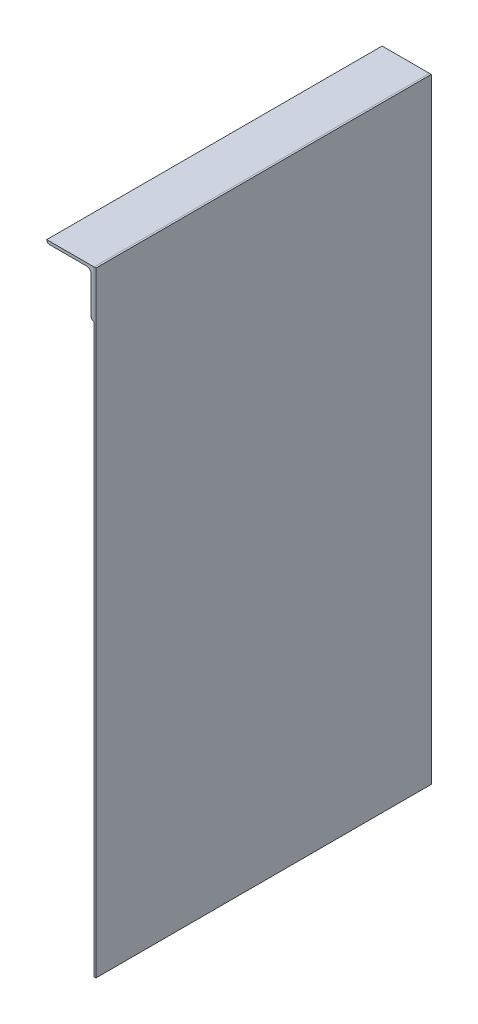
ISO-10303-21;
HEADER;
FILE_DESCRIPTION(('STEP AP214'),'2;1');
FILE_NAME('part.step','',(''),(''),'','','');
FILE_SCHEMA(('AUTOMOTIVE_DESIGN { 1 0 10303 214 1 1 1 1 }'));
ENDSEC;
DATA;
#1=APPLICATION_CONTEXT('core data for automotive mechanical design processes');
#2=APPLICATION_PROTOCOL_DEFINITION('international standard','automotive_design',2000,#1);
#3=PRODUCT_CONTEXT('',#1,'mechanical');
#4=PRODUCT('Part','Part','',(#3));
#5=PRODUCT_RELATED_PRODUCT_CATEGORY('part','',(#4));
#6=PRODUCT_DEFINITION_FORMATION('','',#4);
#7=PRODUCT_DEFINITION_CONTEXT('part definition',#1,'design');
#8=PRODUCT_DEFINITION('design','',#6,#7);
#9=PRODUCT_DEFINITION_SHAPE('','',#8);
#10=(LENGTH_UNIT() NAMED_UNIT(*) SI_UNIT(.MILLI.,.METRE.));
#11=(NAMED_UNIT(*) PLANE_ANGLE_UNIT() SI_UNIT($,.RADIAN.));
#12=(NAMED_UNIT(*) SI_UNIT($,.STERADIAN.) SOLID_ANGLE_UNIT());
#13=UNCERTAINTY_MEASURE_WITH_UNIT(LENGTH_MEASURE(1.E-05),#10,'distance_accuracy_value','');
#14=(GEOMETRIC_REPRESENTATION_CONTEXT(3) GLOBAL_UNCERTAINTY_ASSIGNED_CONTEXT((#13)) GLOBAL_UNIT_ASSIGNED_CONTEXT((#10,
#11,#12)) REPRESENTATION_CONTEXT('',''));
#15=CARTESIAN_POINT('',(0.,0.,0.));
#16=DIRECTION('',(0.,0.,1.));
#17=DIRECTION('',(1.,0.,0.));
#18=AXIS2_PLACEMENT_3D('',#15,#16,#17);
#19=CARTESIAN_POINT('',(2.,0.,0.));
#20=DIRECTION('',(0.,0.,1.));
#21=DIRECTION('',(1.,0.,0.));
#22=AXIS2_PLACEMENT_3D('',#19,#20,#21);
#23=PLANE('',#22);
#24=DIRECTION('',(0.,1.,0.));
#25=VECTOR('',#24,1.);
#26=CARTESIAN_POINT('',(0.,0.,0.));
#27=LINE('',#26,#25);
#28=CARTESIAN_POINT('',(6.91313305090941E-12,-660.,0.));
#29=VERTEX_POINT('',#28);
#30=CARTESIAN_POINT('',(0.,0.,0.));
#31=VERTEX_POINT('',#30);
#32=EDGE_CURVE('E143',#29,#31,#27,.T.);
#33=ORIENTED_EDGE('',*,*,#32,.T.);
#34=DIRECTION('',(-1.,0.,0.));
#35=VECTOR('',#34,1.);
#36=CARTESIAN_POINT('',(2.,0.,0.));
#37=LINE('',#36,#35);
#38=CARTESIAN_POINT('',(2.,0.,0.));
#39=VERTEX_POINT('',#38);
#40=EDGE_CURVE('E14',#39,#31,#37,.T.);
#41=ORIENTED_EDGE('',*,*,#40,.F.);
#42=DIRECTION('',(0.,1.,0.));
#43=VECTOR('',#42,1.);
#44=CARTESIAN_POINT('',(2.,0.,0.));
#45=LINE('',#44,#43);
#46=CARTESIAN_POINT('',(2.00000000000691,-660.,0.));
#47=VERTEX_POINT('',#46);
#48=EDGE_CURVE('E131',#47,#39,#45,.T.);
#49=ORIENTED_EDGE('',*,*,#48,.F.);
#50=DIRECTION('',(-1.,0.,0.));
#51=VECTOR('',#50,1.);
#52=CARTESIAN_POINT('',(2.00000000000691,-660.,0.));
#53=LINE('',#52,#51);
#54=EDGE_CURVE('E139',#47,#29,#53,.T.);
#55=ORIENTED_EDGE('',*,*,#54,.T.);
#56=EDGE_LOOP('',(#33,#41,#49,#55));
#57=FACE_BOUND('',#56,.T.);
#58=ADVANCED_FACE('F80',(#57),#23,.F.);
#59=CARTESIAN_POINT('',(2.,0.,0.));
#60=DIRECTION('',(0.,-1.,0.));
#61=DIRECTION('',(1.,0.,0.));
#62=AXIS2_PLACEMENT_3D('',#59,#60,#61);
#63=PLANE('',#62);
#64=DIRECTION('',(0.,0.,1.));
#65=VECTOR('',#64,1.);
#66=CARTESIAN_POINT('',(0.,0.,0.));
#67=LINE('',#66,#65);
#68=CARTESIAN_POINT('',(0.,0.,360.));
#69=VERTEX_POINT('',#68);
#70=EDGE_CURVE('E135',#31,#69,#67,.T.);
#71=ORIENTED_EDGE('',*,*,#70,.T.);
#72=DIRECTION('',(-1.,0.,0.));
#73=VECTOR('',#72,1.);
#74=CARTESIAN_POINT('',(2.,0.,360.));
#75=LINE('',#74,#73);
#76=CARTESIAN_POINT('',(2.,0.,360.));
#77=VERTEX_POINT('',#76);
#78=EDGE_CURVE('E88',#77,#69,#75,.T.);
#79=ORIENTED_EDGE('',*,*,#78,.F.);
#80=DIRECTION('',(0.,0.,1.));
#81=VECTOR('',#80,1.);
#82=CARTESIAN_POINT('',(2.,0.,0.));
#83=LINE('',#82,#81);
#84=EDGE_CURVE('E126',#39,#77,#83,.T.);
#85=ORIENTED_EDGE('',*,*,#84,.F.);
#86=ORIENTED_EDGE('',*,*,#40,.T.);
#87=EDGE_LOOP('',(#71,#79,#85,#86));
#88=FACE_BOUND('',#87,.T.);
#89=ADVANCED_FACE('F134',(#88),#63,.F.);
#90=CARTESIAN_POINT('',(2.,0.,360.));
#91=DIRECTION('',(0.,0.,-1.));
#92=DIRECTION('',(-1.,0.,0.));
#93=AXIS2_PLACEMENT_3D('',#90,#91,#92);
#94=PLANE('',#93);
#95=DIRECTION('',(0.,-1.,0.));
#96=VECTOR('',#95,1.);
#97=CARTESIAN_POINT('',(0.,0.,360.));
#98=LINE('',#97,#96);
#99=CARTESIAN_POINT('',(6.91313305090941E-12,-660.,360.));
#100=VERTEX_POINT('',#99);
#101=EDGE_CURVE('E113',#69,#100,#98,.T.);
#102=ORIENTED_EDGE('',*,*,#101,.T.);
#103=DIRECTION('',(-1.,0.,0.));
#104=VECTOR('',#103,1.);
#105=CARTESIAN_POINT('',(2.00000000000691,-660.,360.));
#106=LINE('',#105,#104);
#107=CARTESIAN_POINT('',(2.00000000000691,-660.,360.));
#108=VERTEX_POINT('',#107);
#109=EDGE_CURVE('E136',#108,#100,#106,.T.);
#110=ORIENTED_EDGE('',*,*,#109,.F.);
#111=DIRECTION('',(0.,-1.,0.));
#112=VECTOR('',#111,1.);
#113=CARTESIAN_POINT('',(2.,0.,360.));
#114=LINE('',#113,#112);
#115=EDGE_CURVE('E129',#77,#108,#114,.T.);
#116=ORIENTED_EDGE('',*,*,#115,.F.);
#117=ORIENTED_EDGE('',*,*,#78,.T.);
#118=EDGE_LOOP('',(#102,#110,#116,#117));
#119=FACE_BOUND('',#118,.T.);
#120=ADVANCED_FACE('F137',(#119),#94,.F.);
#121=CARTESIAN_POINT('',(2.00000000000691,-660.,0.));
#122=DIRECTION('',(0.,1.,0.));
#123=DIRECTION('',(-1.,0.,0.));
#124=AXIS2_PLACEMENT_3D('',#121,#122,#123);
#125=PLANE('',#124);
#126=DIRECTION('',(0.,0.,-1.));
#127=VECTOR('',#126,1.);
#128=CARTESIAN_POINT('',(6.91313305090941E-12,-660.,0.));
#129=LINE('',#128,#127);
#130=EDGE_CURVE('E119',#100,#29,#129,.T.);
#131=ORIENTED_EDGE('',*,*,#130,.T.);
#132=ORIENTED_EDGE('',*,*,#54,.F.);
#133=DIRECTION('',(0.,0.,-1.));
#134=VECTOR('',#133,1.);
#135=CARTESIAN_POINT('',(2.00000000000691,-660.,0.));
#136=LINE('',#135,#134);
#137=EDGE_CURVE('E96',#108,#47,#136,.T.);
#138=ORIENTED_EDGE('',*,*,#137,.F.);
#139=ORIENTED_EDGE('',*,*,#109,.T.);
#140=EDGE_LOOP('',(#131,#132,#138,#139));
#141=FACE_BOUND('',#140,.T.);
#142=ADVANCED_FACE('F150',(#141),#125,.F.);
#143=CARTESIAN_POINT('',(2.,0.,0.));
#144=DIRECTION('',(-1.,0.,0.));
#145=DIRECTION('',(0.,-1.,0.));
#146=AXIS2_PLACEMENT_3D('',#143,#144,#145);
#147=PLANE('',#146);
#148=ORIENTED_EDGE('',*,*,#48,.T.);
#149=ORIENTED_EDGE('',*,*,#84,.T.);
#150=ORIENTED_EDGE('',*,*,#115,.T.);
#151=ORIENTED_EDGE('',*,*,#137,.T.);
#152=EDGE_LOOP('',(#148,#149,#150,#151));
#153=FACE_BOUND('',#152,.T.);
#154=ADVANCED_FACE('F127',(#153),#147,.F.);
#155=CARTESIAN_POINT('',(0.,0.,0.));
#156=DIRECTION('',(-1.,0.,0.));
#157=DIRECTION('',(0.,-1.,0.));
#158=AXIS2_PLACEMENT_3D('',#155,#156,#157);
#159=PLANE('',#158);
#160=ORIENTED_EDGE('',*,*,#32,.F.);
#161=ORIENTED_EDGE('',*,*,#130,.F.);
#162=ORIENTED_EDGE('',*,*,#101,.F.);
#163=ORIENTED_EDGE('',*,*,#70,.F.);
#164=EDGE_LOOP('',(#160,#161,#162,#163));
#165=FACE_BOUND('',#164,.T.);
#166=ADVANCED_FACE('F153',(#165),#159,.T.);
#167=CLOSED_SHELL('',(#58,#89,#120,#142,#154,#166));
#168=MANIFOLD_SOLID_BREP('B2',#167);
#169=CARTESIAN_POINT('',(-50.8,0.,5.32101756039693E-13));
#170=DIRECTION('',(0.,0.,1.));
#171=DIRECTION('',(1.,0.,0.));
#172=AXIS2_PLACEMENT_3D('',#169,#170,#171);
#173=PLANE('',#172);
#174=DIRECTION('',(-1.,0.,0.));
#175=VECTOR('',#174,1.);
#176=CARTESIAN_POINT('',(-50.8,-5.32101756039694E-13,5.32101756039693E-13));
#177=LINE('',#176,#175);
#178=CARTESIAN_POINT('',(0.,0.,0.));
#179=VERTEX_POINT('',#178);
#180=CARTESIAN_POINT('',(-50.8,-5.32101862300415E-13,5.32101809170054E-13));
#181=VERTEX_POINT('',#180);
#182=EDGE_CURVE('E322',#179,#181,#177,.T.);
#183=ORIENTED_EDGE('',*,*,#182,.F.);
#184=DIRECTION('',(0.,-1.,0.));
#185=VECTOR('',#184,1.);
#186=CARTESIAN_POINT('',(0.,0.,0.));
#187=LINE('',#186,#185);
#188=CARTESIAN_POINT('',(0.,-660.,0.));
#189=VERTEX_POINT('',#188);
#190=EDGE_CURVE('E218',#179,#189,#187,.T.);
#191=ORIENTED_EDGE('',*,*,#190,.T.);
#192=DIRECTION('',(-1.,0.,0.));
#193=VECTOR('',#192,1.);
#194=CARTESIAN_POINT('',(-50.8,-660.,5.32101756039693E-13));
#195=LINE('',#194,#193);
#196=CARTESIAN_POINT('',(-50.8,-660.,5.32101756039693E-13));
#197=VERTEX_POINT('',#196);
#198=EDGE_CURVE('E330',#189,#197,#195,.T.);
#199=ORIENTED_EDGE('',*,*,#198,.T.);
#200=DIRECTION('',(0.,-1.,0.));
#201=VECTOR('',#200,1.);
#202=CARTESIAN_POINT('',(-50.8,0.,5.32101756039693E-13));
#203=LINE('',#202,#201);
#204=EDGE_CURVE('E273',#181,#197,#203,.T.);
#205=ORIENTED_EDGE('',*,*,#204,.F.);
#206=EDGE_LOOP('',(#183,#191,#199,#205));
#207=FACE_BOUND('',#206,.T.);
#208=ADVANCED_FACE('F214',(#207),#173,.F.);
#209=CARTESIAN_POINT('',(-50.8,0.,0.0050800000005321));
#210=DIRECTION('',(1.,0.,0.));
#211=DIRECTION('',(0.,0.,-1.));
#212=AXIS2_PLACEMENT_3D('',#209,#210,#211);
#213=PLANE('',#212);
#214=DIRECTION('',(0.,-0.707106781186548,0.707106781186547));
#215=VECTOR('',#214,1.);
#216=CARTESIAN_POINT('',(-50.8,-0.00254000000026605,0.00254000000026605));
#217=LINE('',#216,#215);
#218=CARTESIAN_POINT('',(-50.8,-0.00508000000053172,0.00508000000053171));
#219=VERTEX_POINT('',#218);
#220=EDGE_CURVE('E280',#181,#219,#217,.T.);
#221=ORIENTED_EDGE('',*,*,#220,.F.);
#222=ORIENTED_EDGE('',*,*,#204,.T.);
#223=DIRECTION('',(0.,0.,1.));
#224=VECTOR('',#223,1.);
#225=CARTESIAN_POINT('',(-50.8,-660.,0.0050800000005321));
#226=LINE('',#225,#224);
#227=CARTESIAN_POINT('',(-50.8,-660.,0.00508000000053171));
#228=VERTEX_POINT('',#227);
#229=EDGE_CURVE('E329',#197,#228,#226,.T.);
#230=ORIENTED_EDGE('',*,*,#229,.T.);
#231=DIRECTION('',(0.,-1.,0.));
#232=VECTOR('',#231,1.);
#233=CARTESIAN_POINT('',(-50.8,0.,0.00508000000053171));
#234=LINE('',#233,#232);
#235=EDGE_CURVE('E331',#219,#228,#234,.T.);
#236=ORIENTED_EDGE('',*,*,#235,.F.);
#237=EDGE_LOOP('',(#221,#222,#230,#236));
#238=FACE_BOUND('',#237,.T.);
#239=ADVANCED_FACE('F365',(#238),#213,.F.);
#240=CARTESIAN_POINT('',(-47.63008,0.,0.00508000000049851));
#241=DIRECTION('',(0.,-1.,0.));
#242=DIRECTION('',(0.,0.,-1.));
#243=AXIS2_PLACEMENT_3D('',#240,#241,#242);
#244=CYLINDRICAL_SURFACE('',#243,3.16992);
#245=CARTESIAN_POINT('',(-47.63008,-0.00508000000049851,0.00508000000049851));
#246=DIRECTION('',(0.,0.707106781186547,0.707106781186548));
#247=DIRECTION('',(0.,-0.707106781186548,0.707106781186547));
#248=AXIS2_PLACEMENT_3D('',#245,#246,#247);
#249=ELLIPSE('',#248,4.48294385563772,3.16992);
#250=CARTESIAN_POINT('',(-47.63008,-3.17500000000029,3.1750000000005));
#251=VERTEX_POINT('',#250);
#252=EDGE_CURVE('E318',#219,#251,#249,.T.);
#253=ORIENTED_EDGE('',*,*,#252,.F.);
#254=ORIENTED_EDGE('',*,*,#235,.T.);
#255=CARTESIAN_POINT('',(-47.63008,-660.,0.00508000000049851));
#256=DIRECTION('',(0.,1.,0.));
#257=DIRECTION('',(0.,0.,1.));
#258=AXIS2_PLACEMENT_3D('',#255,#256,#257);
#259=CIRCLE('',#258,3.16992);
#260=CARTESIAN_POINT('',(-47.63008,-660.,3.1750000000005));
#261=VERTEX_POINT('',#260);
#262=EDGE_CURVE('E333',#228,#261,#259,.T.);
#263=ORIENTED_EDGE('',*,*,#262,.T.);
#264=DIRECTION('',(0.,-1.,0.));
#265=VECTOR('',#264,1.);
#266=CARTESIAN_POINT('',(-47.63008,0.,3.1750000000005));
#267=LINE('',#266,#265);
#268=EDGE_CURVE('E334',#251,#261,#267,.T.);
#269=ORIENTED_EDGE('',*,*,#268,.F.);
#270=EDGE_LOOP('',(#253,#254,#263,#269));
#271=FACE_BOUND('',#270,.T.);
#272=ADVANCED_FACE('F368',(#271),#244,.T.);
#273=CARTESIAN_POINT('',(-7.93749999999998,0.,3.17500000000008));
#274=DIRECTION('',(0.,0.,-1.));
#275=DIRECTION('',(-1.,0.,0.));
#276=AXIS2_PLACEMENT_3D('',#273,#274,#275);
#277=PLANE('',#276);
#278=DIRECTION('',(1.,0.,0.));
#279=VECTOR('',#278,1.);
#280=CARTESIAN_POINT('',(-7.93749999999995,-3.17500000000008,3.17500000000008));
#281=LINE('',#280,#279);
#282=CARTESIAN_POINT('',(-7.93749999999998,-3.17500000000008,3.17500000000008));
#283=VERTEX_POINT('',#282);
#284=EDGE_CURVE('E315',#251,#283,#281,.T.);
#285=ORIENTED_EDGE('',*,*,#284,.F.);
#286=ORIENTED_EDGE('',*,*,#268,.T.);
#287=DIRECTION('',(1.,0.,0.));
#288=VECTOR('',#287,1.);
#289=CARTESIAN_POINT('',(-7.93749999999998,-660.,3.17500000000008));
#290=LINE('',#289,#288);
#291=CARTESIAN_POINT('',(-7.93749999999998,-660.,3.17500000000008));
#292=VERTEX_POINT('',#291);
#293=EDGE_CURVE('E336',#261,#292,#290,.T.);
#294=ORIENTED_EDGE('',*,*,#293,.T.);
#295=DIRECTION('',(0.,-1.,0.));
#296=VECTOR('',#295,1.);
#297=CARTESIAN_POINT('',(-7.93749999999998,0.,3.17500000000008));
#298=LINE('',#297,#296);
#299=EDGE_CURVE('E337',#283,#292,#298,.T.);
#300=ORIENTED_EDGE('',*,*,#299,.F.);
#301=EDGE_LOOP('',(#285,#286,#294,#300));
#302=FACE_BOUND('',#301,.T.);
#303=ADVANCED_FACE('F370',(#302),#277,.F.);
#304=CARTESIAN_POINT('',(-7.93749999999993,0.,7.93750000000008));
#305=DIRECTION('',(0.,-1.,0.));
#306=DIRECTION('',(0.,0.,-1.));
#307=AXIS2_PLACEMENT_3D('',#304,#305,#306);
#308=CYLINDRICAL_SURFACE('',#307,4.7625);
#309=CARTESIAN_POINT('',(-7.93749999999993,-7.93750000000008,7.93750000000008));
#310=DIRECTION('',(0.,0.707106781186547,0.707106781186548));
#311=DIRECTION('',(0.,-0.707106781186548,0.707106781186547));
#312=AXIS2_PLACEMENT_3D('',#309,#310,#311);
#313=ELLIPSE('',#312,6.73519209080187,4.7625);
#314=CARTESIAN_POINT('',(-3.17499999999993,-7.93750000000003,7.93750000000003));
#315=VERTEX_POINT('',#314);
#316=EDGE_CURVE('E310',#283,#315,#313,.F.);
#317=ORIENTED_EDGE('',*,*,#316,.F.);
#318=ORIENTED_EDGE('',*,*,#299,.T.);
#319=CARTESIAN_POINT('',(-7.93749999999993,-660.,7.93750000000008));
#320=DIRECTION('',(0.,-1.,0.));
#321=DIRECTION('',(0.,0.,-1.));
#322=AXIS2_PLACEMENT_3D('',#319,#320,#321);
#323=CIRCLE('',#322,4.7625);
#324=CARTESIAN_POINT('',(-3.17499999999993,-660.,7.93750000000003));
#325=VERTEX_POINT('',#324);
#326=EDGE_CURVE('E339',#292,#325,#323,.T.);
#327=ORIENTED_EDGE('',*,*,#326,.T.);
#328=DIRECTION('',(0.,-1.,0.));
#329=VECTOR('',#328,1.);
#330=CARTESIAN_POINT('',(-3.17499999999993,0.,7.93750000000003));
#331=LINE('',#330,#329);
#332=EDGE_CURVE('E340',#315,#325,#331,.T.);
#333=ORIENTED_EDGE('',*,*,#332,.F.);
#334=EDGE_LOOP('',(#317,#318,#327,#333));
#335=FACE_BOUND('',#334,.T.);
#336=ADVANCED_FACE('F374',(#335),#308,.F.);
#337=CARTESIAN_POINT('',(-3.1749999999995,0.,47.63008));
#338=DIRECTION('',(1.,0.,0.));
#339=DIRECTION('',(0.,0.,-1.));
#340=AXIS2_PLACEMENT_3D('',#337,#338,#339);
#341=PLANE('',#340);
#342=DIRECTION('',(0.,-0.707106781186548,0.707106781186547));
#343=VECTOR('',#342,1.);
#344=CARTESIAN_POINT('',(-3.17499999999976,-23.81504,23.81504));
#345=LINE('',#344,#343);
#346=CARTESIAN_POINT('',(-3.1749999999995,-47.63008,47.63008));
#347=VERTEX_POINT('',#346);
#348=EDGE_CURVE('E308',#315,#347,#345,.T.);
#349=ORIENTED_EDGE('',*,*,#348,.F.);
#350=ORIENTED_EDGE('',*,*,#332,.T.);
#351=DIRECTION('',(0.,0.,1.));
#352=VECTOR('',#351,1.);
#353=CARTESIAN_POINT('',(-3.1749999999995,-660.,47.63008));
#354=LINE('',#353,#352);
#355=CARTESIAN_POINT('',(-3.1749999999995,-660.,47.63008));
#356=VERTEX_POINT('',#355);
#357=EDGE_CURVE('E342',#325,#356,#354,.T.);
#358=ORIENTED_EDGE('',*,*,#357,.T.);
#359=DIRECTION('',(0.,-1.,0.));
#360=VECTOR('',#359,1.);
#361=CARTESIAN_POINT('',(-3.1749999999995,0.,47.63008));
#362=LINE('',#361,#360);
#363=EDGE_CURVE('E343',#347,#356,#362,.T.);
#364=ORIENTED_EDGE('',*,*,#363,.F.);
#365=EDGE_LOOP('',(#349,#350,#358,#364));
#366=FACE_BOUND('',#365,.T.);
#367=ADVANCED_FACE('F378',(#366),#341,.F.);
#368=CARTESIAN_POINT('',(-0.0050799999995013,0.,47.63008));
#369=DIRECTION('',(0.,-1.,0.));
#370=DIRECTION('',(0.,0.,-1.));
#371=AXIS2_PLACEMENT_3D('',#368,#369,#370);
#372=CYLINDRICAL_SURFACE('',#371,3.16992);
#373=CARTESIAN_POINT('',(-0.0050799999995013,-47.63008,47.63008));
#374=DIRECTION('',(0.,0.707106781186547,0.707106781186548));
#375=DIRECTION('',(0.,-0.707106781186548,0.707106781186547));
#376=AXIS2_PLACEMENT_3D('',#373,#374,#375);
#377=ELLIPSE('',#376,4.48294385563772,3.16992);
#378=CARTESIAN_POINT('',(-0.0050799999994679,-50.8,50.8));
#379=VERTEX_POINT('',#378);
#380=EDGE_CURVE('E223',#347,#379,#377,.T.);
#381=ORIENTED_EDGE('',*,*,#380,.F.);
#382=ORIENTED_EDGE('',*,*,#363,.T.);
#383=CARTESIAN_POINT('',(-0.0050799999995013,-660.,47.63008));
#384=DIRECTION('',(0.,1.,0.));
#385=DIRECTION('',(0.,0.,-1.));
#386=AXIS2_PLACEMENT_3D('',#383,#384,#385);
#387=CIRCLE('',#386,3.16992);
#388=CARTESIAN_POINT('',(-0.0050799999994679,-660.,50.8));
#389=VERTEX_POINT('',#388);
#390=EDGE_CURVE('E302',#356,#389,#387,.T.);
#391=ORIENTED_EDGE('',*,*,#390,.T.);
#392=DIRECTION('',(0.,-1.,0.));
#393=VECTOR('',#392,1.);
#394=CARTESIAN_POINT('',(-0.0050799999994679,0.,50.8));
#395=LINE('',#394,#393);
#396=EDGE_CURVE('E293',#379,#389,#395,.T.);
#397=ORIENTED_EDGE('',*,*,#396,.F.);
#398=EDGE_LOOP('',(#381,#382,#391,#397));
#399=FACE_BOUND('',#398,.T.);
#400=ADVANCED_FACE('F299',(#399),#372,.T.);
#401=CARTESIAN_POINT('',(5.32101756039693E-13,0.,50.8));
#402=DIRECTION('',(0.,0.,-1.));
#403=DIRECTION('',(-1.,0.,0.));
#404=AXIS2_PLACEMENT_3D('',#401,#402,#403);
#405=PLANE('',#404);
#406=DIRECTION('',(1.,0.,0.));
#407=VECTOR('',#406,1.);
#408=CARTESIAN_POINT('',(5.32101756039693E-13,-50.8,50.8));
#409=LINE('',#408,#407);
#410=CARTESIAN_POINT('',(5.32101756039693E-13,-50.8,50.8));
#411=VERTEX_POINT('',#410);
#412=EDGE_CURVE('E78',#379,#411,#409,.T.);
#413=ORIENTED_EDGE('',*,*,#412,.F.);
#414=ORIENTED_EDGE('',*,*,#396,.T.);
#415=DIRECTION('',(1.,0.,0.));
#416=VECTOR('',#415,1.);
#417=CARTESIAN_POINT('',(5.32101756039693E-13,-660.,50.8));
#418=LINE('',#417,#416);
#419=CARTESIAN_POINT('',(5.32101756039693E-13,-660.,50.8));
#420=VERTEX_POINT('',#419);
#421=EDGE_CURVE('E304',#389,#420,#418,.T.);
#422=ORIENTED_EDGE('',*,*,#421,.T.);
#423=DIRECTION('',(0.,-1.,0.));
#424=VECTOR('',#423,1.);
#425=CARTESIAN_POINT('',(5.32101756039693E-13,0.,50.8));
#426=LINE('',#425,#424);
#427=EDGE_CURVE('E236',#411,#420,#426,.T.);
#428=ORIENTED_EDGE('',*,*,#427,.F.);
#429=EDGE_LOOP('',(#413,#414,#422,#428));
#430=FACE_BOUND('',#429,.T.);
#431=ADVANCED_FACE('F292',(#430),#405,.F.);
#432=CARTESIAN_POINT('',(0.,0.,0.));
#433=DIRECTION('',(-1.,0.,0.));
#434=DIRECTION('',(0.,0.,1.));
#435=AXIS2_PLACEMENT_3D('',#432,#433,#434);
#436=PLANE('',#435);
#437=DIRECTION('',(0.,0.707106781186548,-0.707106781186547));
#438=VECTOR('',#437,1.);
#439=CARTESIAN_POINT('',(0.,0.,0.));
#440=LINE('',#439,#438);
#441=EDGE_CURVE('E325',#411,#179,#440,.T.);
#442=ORIENTED_EDGE('',*,*,#441,.F.);
#443=ORIENTED_EDGE('',*,*,#427,.T.);
#444=DIRECTION('',(0.,0.,-1.));
#445=VECTOR('',#444,1.);
#446=CARTESIAN_POINT('',(0.,-660.,0.));
#447=LINE('',#446,#445);
#448=EDGE_CURVE('E327',#420,#189,#447,.T.);
#449=ORIENTED_EDGE('',*,*,#448,.T.);
#450=ORIENTED_EDGE('',*,*,#190,.F.);
#451=EDGE_LOOP('',(#442,#443,#449,#450));
#452=FACE_BOUND('',#451,.T.);
#453=ADVANCED_FACE('F360',(#452),#436,.F.);
#454=CARTESIAN_POINT('',(-0.0050799999995013,-660.,47.63008));
#455=DIRECTION('',(0.,-1.,0.));
#456=DIRECTION('',(0.,0.,-1.));
#457=AXIS2_PLACEMENT_3D('',#454,#455,#456);
#458=PLANE('',#457);
#459=ORIENTED_EDGE('',*,*,#198,.F.);
#460=ORIENTED_EDGE('',*,*,#448,.F.);
#461=ORIENTED_EDGE('',*,*,#421,.F.);
#462=ORIENTED_EDGE('',*,*,#390,.F.);
#463=ORIENTED_EDGE('',*,*,#357,.F.);
#464=ORIENTED_EDGE('',*,*,#326,.F.);
#465=ORIENTED_EDGE('',*,*,#293,.F.);
#466=ORIENTED_EDGE('',*,*,#262,.F.);
#467=ORIENTED_EDGE('',*,*,#229,.F.);
#468=EDGE_LOOP('',(#459,#460,#461,#462,#463,#464,#465,#466,#467));
#469=FACE_BOUND('',#468,.T.);
#470=ADVANCED_FACE('F362',(#469),#458,.T.);
#471=CARTESIAN_POINT('',(0.,0.,0.));
#472=DIRECTION('',(0.,0.707106781186547,0.707106781186548));
#473=DIRECTION('',(0.,-0.707106781186548,0.707106781186547));
#474=AXIS2_PLACEMENT_3D('',#471,#472,#473);
#475=PLANE('',#474);
#476=ORIENTED_EDGE('',*,*,#441,.T.);
#477=ORIENTED_EDGE('',*,*,#182,.T.);
#478=ORIENTED_EDGE('',*,*,#220,.T.);
#479=ORIENTED_EDGE('',*,*,#252,.T.);
#480=ORIENTED_EDGE('',*,*,#284,.T.);
#481=ORIENTED_EDGE('',*,*,#316,.T.);
#482=ORIENTED_EDGE('',*,*,#348,.T.);
#483=ORIENTED_EDGE('',*,*,#380,.T.);
#484=ORIENTED_EDGE('',*,*,#412,.T.);
#485=EDGE_LOOP('',(#476,#477,#478,#479,#480,#481,#482,#483,#484));
#486=FACE_BOUND('',#485,.T.);
#487=ADVANCED_FACE('F216',(#486),#475,.T.);
#488=CLOSED_SHELL('',(#208,#239,#272,#303,#336,#367,#400,#431,#453,#470,#487));
#489=MANIFOLD_SOLID_BREP('B8',#488);
#490=CARTESIAN_POINT('',(-50.8,-5.76189040808998E-13,360.));
#491=DIRECTION('',(0.,-1.,0.));
#492=DIRECTION('',(1.,0.,0.));
#493=AXIS2_PLACEMENT_3D('',#490,#491,#492);
#494=PLANE('',#493);
#495=DIRECTION('',(1.,0.,0.));
#496=VECTOR('',#495,1.);
#497=CARTESIAN_POINT('',(-50.8000000000038,-5.32101756039733E-13,4.9960036108132E-13));
#498=LINE('',#497,#496);
#499=CARTESIAN_POINT('',(-50.8,-5.29728846368322E-13,5.55111512312578E-13));
#500=VERTEX_POINT('',#499);
#501=CARTESIAN_POINT('',(0.,0.,0.));
#502=VERTEX_POINT('',#501);
#503=EDGE_CURVE('E607',#500,#502,#498,.T.);
#504=ORIENTED_EDGE('',*,*,#503,.F.);
#505=DIRECTION('',(0.,0.,-1.));
#506=VECTOR('',#505,1.);
#507=CARTESIAN_POINT('',(-50.8,-5.76189040808998E-13,360.));
#508=LINE('',#507,#506);
#509=CARTESIAN_POINT('',(-50.8,-5.76189040808998E-13,360.));
#510=VERTEX_POINT('',#509);
#511=EDGE_CURVE('E612',#510,#500,#508,.T.);
#512=ORIENTED_EDGE('',*,*,#511,.F.);
#513=DIRECTION('',(-1.,0.,0.));
#514=VECTOR('',#513,1.);
#515=CARTESIAN_POINT('',(-50.8,-5.76189040808998E-13,360.));
#516=LINE('',#515,#514);
#517=CARTESIAN_POINT('',(0.,0.,360.));
#518=VERTEX_POINT('',#517);
#519=EDGE_CURVE('E599',#518,#510,#516,.T.);
#520=ORIENTED_EDGE('',*,*,#519,.F.);
#521=DIRECTION('',(0.,0.,-1.));
#522=VECTOR('',#521,1.);
#523=CARTESIAN_POINT('',(0.,0.,360.));
#524=LINE('',#523,#522);
#525=EDGE_CURVE('E508',#518,#502,#524,.T.);
#526=ORIENTED_EDGE('',*,*,#525,.T.);
#527=EDGE_LOOP('',(#504,#512,#520,#526));
#528=FACE_BOUND('',#527,.T.);
#529=ADVANCED_FACE('F504',(#528),#494,.F.);
#530=CARTESIAN_POINT('',(-50.8,-0.00508000000057619,360.));
#531=DIRECTION('',(1.,0.,0.));
#532=DIRECTION('',(0.,0.,-1.));
#533=AXIS2_PLACEMENT_3D('',#530,#531,#532);
#534=PLANE('',#533);
#535=DIRECTION('',(0.,0.707106781186548,-0.707106781186547));
#536=VECTOR('',#535,1.);
#537=CARTESIAN_POINT('',(-50.8,-180.00254,180.00254));
#538=LINE('',#537,#536);
#539=CARTESIAN_POINT('',(-50.8,-0.00508000000053172,0.00508000000054576));
#540=VERTEX_POINT('',#539);
#541=EDGE_CURVE('E562',#540,#500,#538,.T.);
#542=ORIENTED_EDGE('',*,*,#541,.F.);
#543=DIRECTION('',(0.,0.,-1.));
#544=VECTOR('',#543,1.);
#545=CARTESIAN_POINT('',(-50.8,-0.0050800000005758,360.));
#546=LINE('',#545,#544);
#547=CARTESIAN_POINT('',(-50.8,-0.0050800000005758,360.));
#548=VERTEX_POINT('',#547);
#549=EDGE_CURVE('E614',#548,#540,#546,.T.);
#550=ORIENTED_EDGE('',*,*,#549,.F.);
#551=DIRECTION('',(0.,-1.,0.));
#552=VECTOR('',#551,1.);
#553=CARTESIAN_POINT('',(-50.8,-0.00508000000057619,360.));
#554=LINE('',#553,#552);
#555=EDGE_CURVE('E554',#510,#548,#554,.T.);
#556=ORIENTED_EDGE('',*,*,#555,.F.);
#557=ORIENTED_EDGE('',*,*,#511,.T.);
#558=EDGE_LOOP('',(#542,#550,#556,#557));
#559=FACE_BOUND('',#558,.T.);
#560=ADVANCED_FACE('F665',(#559),#534,.F.);
#561=CARTESIAN_POINT('',(-47.63008,-0.0050800000005426,360.));
#562=DIRECTION('',(0.,0.,-1.));
#563=DIRECTION('',(0.,1.,0.));
#564=AXIS2_PLACEMENT_3D('',#561,#562,#563);
#565=CYLINDRICAL_SURFACE('',#564,3.16992);
#566=CARTESIAN_POINT('',(-47.63008,-0.00508000000049851,0.00508000000054576));
#567=DIRECTION('',(0.,-0.707106781186547,-0.707106781186548));
#568=DIRECTION('',(0.,0.707106781186548,-0.707106781186547));
#569=AXIS2_PLACEMENT_3D('',#566,#567,#568);
#570=ELLIPSE('',#569,4.48294385563772,3.16992);
#571=CARTESIAN_POINT('',(-47.63008,-3.1750000000005,3.17500000000043));
#572=VERTEX_POINT('',#571);
#573=EDGE_CURVE('E212',#572,#540,#570,.T.);
#574=ORIENTED_EDGE('',*,*,#573,.F.);
#575=DIRECTION('',(0.,0.,-1.));
#576=VECTOR('',#575,1.);
#577=CARTESIAN_POINT('',(-47.63008,-3.17500000000054,360.));
#578=LINE('',#577,#576);
#579=CARTESIAN_POINT('',(-47.63008,-3.17500000000054,360.));
#580=VERTEX_POINT('',#579);
#581=EDGE_CURVE('E616',#580,#572,#578,.T.);
#582=ORIENTED_EDGE('',*,*,#581,.F.);
#583=CARTESIAN_POINT('',(-47.63008,-0.0050800000005426,360.));
#584=DIRECTION('',(0.,0.,1.));
#585=DIRECTION('',(0.,-1.,0.));
#586=AXIS2_PLACEMENT_3D('',#583,#584,#585);
#587=CIRCLE('',#586,3.16992);
#588=EDGE_CURVE('E640',#548,#580,#587,.T.);
#589=ORIENTED_EDGE('',*,*,#588,.F.);
#590=ORIENTED_EDGE('',*,*,#549,.T.);
#591=EDGE_LOOP('',(#574,#582,#589,#590));
#592=FACE_BOUND('',#591,.T.);
#593=ADVANCED_FACE('F664',(#592),#565,.T.);
#594=CARTESIAN_POINT('',(-7.93749999999998,-3.17500000000012,360.));
#595=DIRECTION('',(0.,1.,0.));
#596=DIRECTION('',(-1.,0.,0.));
#597=AXIS2_PLACEMENT_3D('',#594,#595,#596);
#598=PLANE('',#597);
#599=DIRECTION('',(-1.,0.,0.));
#600=VECTOR('',#599,1.);
#601=CARTESIAN_POINT('',(-7.93750000000377,-3.17500000000008,3.17500000000009));
#602=LINE('',#601,#600);
#603=CARTESIAN_POINT('',(-7.93749999999998,-3.17500000000008,3.17500000000009));
#604=VERTEX_POINT('',#603);
#605=EDGE_CURVE('E514',#604,#572,#602,.T.);
#606=ORIENTED_EDGE('',*,*,#605,.F.);
#607=DIRECTION('',(0.,0.,-1.));
#608=VECTOR('',#607,1.);
#609=CARTESIAN_POINT('',(-7.93749999999998,-3.17500000000012,360.));
#610=LINE('',#609,#608);
#611=CARTESIAN_POINT('',(-7.93749999999998,-3.17500000000012,360.));
#612=VERTEX_POINT('',#611);
#613=EDGE_CURVE('E619',#612,#604,#610,.T.);
#614=ORIENTED_EDGE('',*,*,#613,.F.);
#615=DIRECTION('',(1.,0.,0.));
#616=VECTOR('',#615,1.);
#617=CARTESIAN_POINT('',(-7.93749999999998,-3.17500000000012,360.));
#618=LINE('',#617,#616);
#619=EDGE_CURVE('E642',#580,#612,#618,.T.);
#620=ORIENTED_EDGE('',*,*,#619,.F.);
#621=ORIENTED_EDGE('',*,*,#581,.T.);
#622=EDGE_LOOP('',(#606,#614,#620,#621));
#623=FACE_BOUND('',#622,.T.);
#624=ADVANCED_FACE('F659',(#623),#598,.F.);
#625=CARTESIAN_POINT('',(-7.93749999999993,-7.93750000000012,360.));
#626=DIRECTION('',(0.,0.,-1.));
#627=DIRECTION('',(0.,1.,0.));
#628=AXIS2_PLACEMENT_3D('',#625,#626,#627);
#629=CYLINDRICAL_SURFACE('',#628,4.7625);
#630=CARTESIAN_POINT('',(-7.93749999999993,-7.93750000000008,7.9375000000001));
#631=DIRECTION('',(0.,-0.707106781186547,-0.707106781186548));
#632=DIRECTION('',(0.,0.707106781186548,-0.707106781186547));
#633=AXIS2_PLACEMENT_3D('',#630,#631,#632);
#634=ELLIPSE('',#633,6.73519209080187,4.7625);
#635=CARTESIAN_POINT('',(-3.17499999999993,-7.93750000000003,7.93750000000004));
#636=VERTEX_POINT('',#635);
#637=EDGE_CURVE('E631',#636,#604,#634,.F.);
#638=ORIENTED_EDGE('',*,*,#637,.F.);
#639=DIRECTION('',(0.,0.,-1.));
#640=VECTOR('',#639,1.);
#641=CARTESIAN_POINT('',(-3.17499999999993,-7.93750000000007,360.));
#642=LINE('',#641,#640);
#643=CARTESIAN_POINT('',(-3.17499999999993,-7.93750000000007,360.));
#644=VERTEX_POINT('',#643);
#645=EDGE_CURVE('E622',#644,#636,#642,.T.);
#646=ORIENTED_EDGE('',*,*,#645,.F.);
#647=CARTESIAN_POINT('',(-7.93749999999993,-7.93750000000012,360.));
#648=DIRECTION('',(0.,0.,-1.));
#649=DIRECTION('',(0.,1.,0.));
#650=AXIS2_PLACEMENT_3D('',#647,#648,#649);
#651=CIRCLE('',#650,4.7625);
#652=EDGE_CURVE('E644',#612,#644,#651,.T.);
#653=ORIENTED_EDGE('',*,*,#652,.F.);
#654=ORIENTED_EDGE('',*,*,#613,.T.);
#655=EDGE_LOOP('',(#638,#646,#653,#654));
#656=FACE_BOUND('',#655,.T.);
#657=ADVANCED_FACE('F656',(#656),#629,.F.);
#658=CARTESIAN_POINT('',(-3.1749999999995,-47.6300800000001,360.));
#659=DIRECTION('',(1.,0.,0.));
#660=DIRECTION('',(0.,1.,0.));
#661=AXIS2_PLACEMENT_3D('',#658,#659,#660);
#662=PLANE('',#661);
#663=DIRECTION('',(0.,0.707106781186548,-0.707106781186547));
#664=VECTOR('',#663,1.);
#665=CARTESIAN_POINT('',(-3.1749999999978,-203.81504,203.81504));
#666=LINE('',#665,#664);
#667=CARTESIAN_POINT('',(-3.1749999999995,-47.63008,47.6300800000001));
#668=VERTEX_POINT('',#667);
#669=EDGE_CURVE('E579',#668,#636,#666,.T.);
#670=ORIENTED_EDGE('',*,*,#669,.F.);
#671=DIRECTION('',(0.,0.,-1.));
#672=VECTOR('',#671,1.);
#673=CARTESIAN_POINT('',(-3.1749999999995,-47.6300800000001,360.));
#674=LINE('',#673,#672);
#675=CARTESIAN_POINT('',(-3.1749999999995,-47.6300800000001,360.));
#676=VERTEX_POINT('',#675);
#677=EDGE_CURVE('E624',#676,#668,#674,.T.);
#678=ORIENTED_EDGE('',*,*,#677,.F.);
#679=DIRECTION('',(0.,-1.,0.));
#680=VECTOR('',#679,1.);
#681=CARTESIAN_POINT('',(-3.1749999999995,-47.6300800000001,360.));
#682=LINE('',#681,#680);
#683=EDGE_CURVE('E646',#644,#676,#682,.T.);
#684=ORIENTED_EDGE('',*,*,#683,.F.);
#685=ORIENTED_EDGE('',*,*,#645,.T.);
#686=EDGE_LOOP('',(#670,#678,#684,#685));
#687=FACE_BOUND('',#686,.T.);
#688=ADVANCED_FACE('F654',(#687),#662,.F.);
#689=CARTESIAN_POINT('',(-0.0050799999995013,-47.63008,360.));
#690=DIRECTION('',(0.,0.,-1.));
#691=DIRECTION('',(0.,1.,0.));
#692=AXIS2_PLACEMENT_3D('',#689,#690,#691);
#693=CYLINDRICAL_SURFACE('',#692,3.16992);
#694=CARTESIAN_POINT('',(-0.0050799999995013,-47.63008,47.63008));
#695=DIRECTION('',(0.,-0.707106781186547,-0.707106781186548));
#696=DIRECTION('',(0.,0.707106781186548,-0.707106781186547));
#697=AXIS2_PLACEMENT_3D('',#694,#695,#696);
#698=ELLIPSE('',#697,4.48294385563772,3.16992);
#699=CARTESIAN_POINT('',(-0.0050799999994679,-50.8,50.8000000000001));
#700=VERTEX_POINT('',#699);
#701=EDGE_CURVE('E585',#700,#668,#698,.T.);
#702=ORIENTED_EDGE('',*,*,#701,.F.);
#703=DIRECTION('',(0.,0.,-1.));
#704=VECTOR('',#703,1.);
#705=CARTESIAN_POINT('',(-0.0050799999994679,-50.8,360.));
#706=LINE('',#705,#704);
#707=CARTESIAN_POINT('',(-0.0050799999994679,-50.8,360.));
#708=VERTEX_POINT('',#707);
#709=EDGE_CURVE('E600',#708,#700,#706,.T.);
#710=ORIENTED_EDGE('',*,*,#709,.F.);
#711=CARTESIAN_POINT('',(-0.0050799999995013,-47.63008,360.));
#712=DIRECTION('',(0.,0.,1.));
#713=DIRECTION('',(0.,1.,0.));
#714=AXIS2_PLACEMENT_3D('',#711,#712,#713);
#715=CIRCLE('',#714,3.16992);
#716=EDGE_CURVE('E628',#676,#708,#715,.T.);
#717=ORIENTED_EDGE('',*,*,#716,.F.);
#718=ORIENTED_EDGE('',*,*,#677,.T.);
#719=EDGE_LOOP('',(#702,#710,#717,#718));
#720=FACE_BOUND('',#719,.T.);
#721=ADVANCED_FACE('F627',(#720),#693,.T.);
#722=CARTESIAN_POINT('',(5.32101756039693E-13,-50.8,360.));
#723=DIRECTION('',(0.,1.,0.));
#724=DIRECTION('',(0.,0.,1.));
#725=AXIS2_PLACEMENT_3D('',#722,#723,#724);
#726=PLANE('',#725);
#727=DIRECTION('',(-1.,0.,0.));
#728=VECTOR('',#727,1.);
#729=CARTESIAN_POINT('',(5.32101756039693E-13,-50.8,50.8));
#730=LINE('',#729,#728);
#731=CARTESIAN_POINT('',(5.32101756039694E-13,-50.8,50.8000000000001));
#732=VERTEX_POINT('',#731);
#733=EDGE_CURVE('E602',#732,#700,#730,.T.);
#734=ORIENTED_EDGE('',*,*,#733,.F.);
#735=DIRECTION('',(0.,0.,-1.));
#736=VECTOR('',#735,1.);
#737=CARTESIAN_POINT('',(5.32101756039693E-13,-50.8,360.));
#738=LINE('',#737,#736);
#739=CARTESIAN_POINT('',(5.32101756039693E-13,-50.8,360.));
#740=VERTEX_POINT('',#739);
#741=EDGE_CURVE('E591',#740,#732,#738,.T.);
#742=ORIENTED_EDGE('',*,*,#741,.F.);
#743=DIRECTION('',(1.,0.,0.));
#744=VECTOR('',#743,1.);
#745=CARTESIAN_POINT('',(5.32101756039693E-13,-50.8,360.));
#746=LINE('',#745,#744);
#747=EDGE_CURVE('E649',#708,#740,#746,.T.);
#748=ORIENTED_EDGE('',*,*,#747,.F.);
#749=ORIENTED_EDGE('',*,*,#709,.T.);
#750=EDGE_LOOP('',(#734,#742,#748,#749));
#751=FACE_BOUND('',#750,.T.);
#752=ADVANCED_FACE('F603',(#751),#726,.F.);
#753=CARTESIAN_POINT('',(0.,0.,360.));
#754=DIRECTION('',(-1.,0.,0.));
#755=DIRECTION('',(0.,-1.,0.));
#756=AXIS2_PLACEMENT_3D('',#753,#754,#755);
#757=PLANE('',#756);
#758=DIRECTION('',(0.,-0.707106781186548,0.707106781186547));
#759=VECTOR('',#758,1.);
#760=CARTESIAN_POINT('',(1.88539992297529E-12,-180.,180.));
#761=LINE('',#760,#759);
#762=EDGE_CURVE('E595',#502,#732,#761,.T.);
#763=ORIENTED_EDGE('',*,*,#762,.F.);
#764=ORIENTED_EDGE('',*,*,#525,.F.);
#765=DIRECTION('',(0.,1.,0.));
#766=VECTOR('',#765,1.);
#767=CARTESIAN_POINT('',(0.,0.,360.));
#768=LINE('',#767,#766);
#769=EDGE_CURVE('E523',#740,#518,#768,.T.);
#770=ORIENTED_EDGE('',*,*,#769,.F.);
#771=ORIENTED_EDGE('',*,*,#741,.T.);
#772=EDGE_LOOP('',(#763,#764,#770,#771));
#773=FACE_BOUND('',#772,.T.);
#774=ADVANCED_FACE('F593',(#773),#757,.F.);
#775=CARTESIAN_POINT('',(-0.0050799999995013,-47.63008,360.));
#776=DIRECTION('',(0.,0.,-1.));
#777=DIRECTION('',(0.,1.,0.));
#778=AXIS2_PLACEMENT_3D('',#775,#776,#777);
#779=PLANE('',#778);
#780=ORIENTED_EDGE('',*,*,#519,.T.);
#781=ORIENTED_EDGE('',*,*,#555,.T.);
#782=ORIENTED_EDGE('',*,*,#588,.T.);
#783=ORIENTED_EDGE('',*,*,#619,.T.);
#784=ORIENTED_EDGE('',*,*,#652,.T.);
#785=ORIENTED_EDGE('',*,*,#683,.T.);
#786=ORIENTED_EDGE('',*,*,#716,.T.);
#787=ORIENTED_EDGE('',*,*,#747,.T.);
#788=ORIENTED_EDGE('',*,*,#769,.T.);
#789=EDGE_LOOP('',(#780,#781,#782,#783,#784,#785,#786,#787,#788));
#790=FACE_BOUND('',#789,.T.);
#791=ADVANCED_FACE('F651',(#790),#779,.F.);
#792=CARTESIAN_POINT('',(0.,0.,0.));
#793=DIRECTION('',(0.,-0.707106781186547,-0.707106781186548));
#794=DIRECTION('',(0.,0.707106781186548,-0.707106781186547));
#795=AXIS2_PLACEMENT_3D('',#792,#793,#794);
#796=PLANE('',#795);
#797=ORIENTED_EDGE('',*,*,#541,.T.);
#798=ORIENTED_EDGE('',*,*,#503,.T.);
#799=ORIENTED_EDGE('',*,*,#762,.T.);
#800=ORIENTED_EDGE('',*,*,#733,.T.);
#801=ORIENTED_EDGE('',*,*,#701,.T.);
#802=ORIENTED_EDGE('',*,*,#669,.T.);
#803=ORIENTED_EDGE('',*,*,#637,.T.);
#804=ORIENTED_EDGE('',*,*,#605,.T.);
#805=ORIENTED_EDGE('',*,*,#573,.T.);
#806=EDGE_LOOP('',(#797,#798,#799,#800,#801,#802,#803,#804,#805));
#807=FACE_BOUND('',#806,.T.);
#808=ADVANCED_FACE('F506',(#807),#796,.T.);
#809=CLOSED_SHELL('',(#529,#560,#593,#624,#657,#688,#721,#752,#774,#791,#808));
#810=MANIFOLD_SOLID_BREP('B72',#809);
#811=ADVANCED_BREP_SHAPE_REPRESENTATION('',(#18,#168,#489,#810),#14);
#812=SHAPE_DEFINITION_REPRESENTATION(#9,#811);
ENDSEC;
END-ISO-10303-21;
